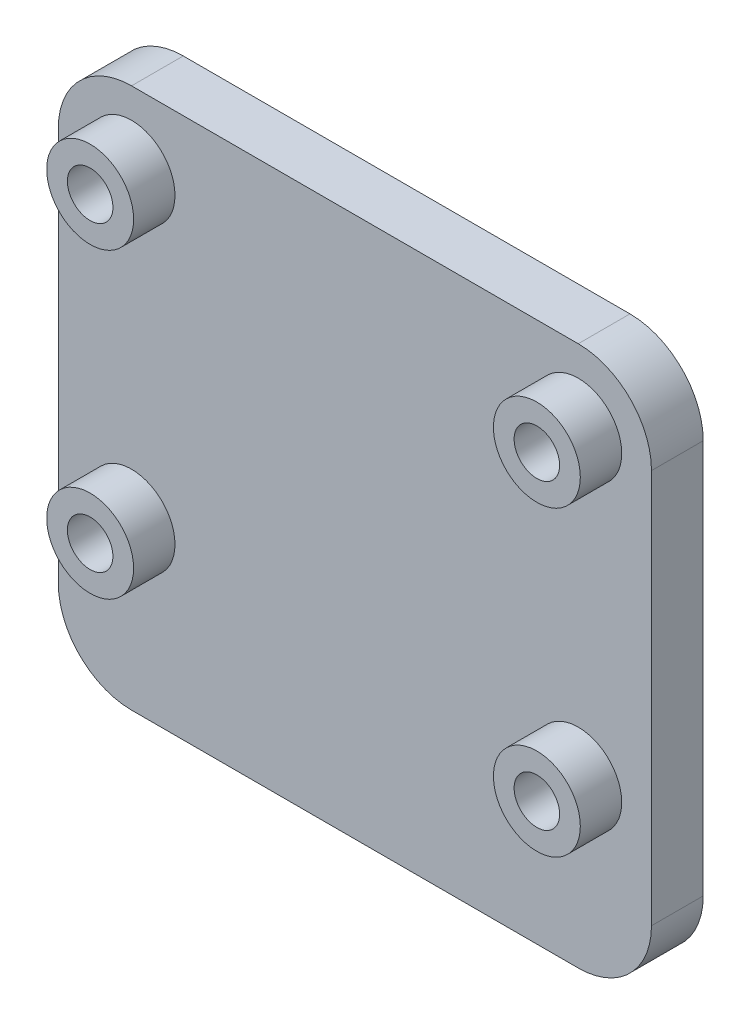
ISO-10303-21;
HEADER;
FILE_DESCRIPTION(('STEP AP214'),'2;1');
FILE_NAME('part.step','',(''),(''),'','','');
FILE_SCHEMA(('AUTOMOTIVE_DESIGN { 1 0 10303 214 1 1 1 1 }'));
ENDSEC;
DATA;
#1=APPLICATION_CONTEXT('core data for automotive mechanical design processes');
#2=APPLICATION_PROTOCOL_DEFINITION('international standard','automotive_design',2000,#1);
#3=PRODUCT_CONTEXT('',#1,'mechanical');
#4=PRODUCT('Part','Part','',(#3));
#5=PRODUCT_RELATED_PRODUCT_CATEGORY('part','',(#4));
#6=PRODUCT_DEFINITION_FORMATION('','',#4);
#7=PRODUCT_DEFINITION_CONTEXT('part definition',#1,'design');
#8=PRODUCT_DEFINITION('design','',#6,#7);
#9=PRODUCT_DEFINITION_SHAPE('','',#8);
#10=(LENGTH_UNIT() NAMED_UNIT(*) SI_UNIT(.MILLI.,.METRE.));
#11=(NAMED_UNIT(*) PLANE_ANGLE_UNIT() SI_UNIT($,.RADIAN.));
#12=(NAMED_UNIT(*) SI_UNIT($,.STERADIAN.) SOLID_ANGLE_UNIT());
#13=UNCERTAINTY_MEASURE_WITH_UNIT(LENGTH_MEASURE(1.E-05),#10,'distance_accuracy_value','');
#14=(GEOMETRIC_REPRESENTATION_CONTEXT(3) GLOBAL_UNCERTAINTY_ASSIGNED_CONTEXT((#13)) GLOBAL_UNIT_ASSIGNED_CONTEXT((#10,
#11,#12)) REPRESENTATION_CONTEXT('',''));
#15=CARTESIAN_POINT('',(0.,0.,0.));
#16=DIRECTION('',(0.,0.,1.));
#17=DIRECTION('',(1.,0.,0.));
#18=AXIS2_PLACEMENT_3D('',#15,#16,#17);
#19=CARTESIAN_POINT('',(0.,0.,2.5));
#20=DIRECTION('',(0.,0.,1.));
#21=DIRECTION('',(1.,0.,0.));
#22=AXIS2_PLACEMENT_3D('',#19,#20,#21);
#23=PLANE('',#22);
#24=CARTESIAN_POINT('',(10.795,-5.08,2.5));
#25=DIRECTION('',(0.,0.,1.));
#26=DIRECTION('',(1.,0.,0.));
#27=AXIS2_PLACEMENT_3D('',#24,#25,#26);
#28=CIRCLE('',#27,2.1);
#29=CARTESIAN_POINT('',(12.895,-5.08,2.5));
#30=VERTEX_POINT('',#29);
#31=EDGE_CURVE('E242',#30,#30,#28,.T.);
#32=ORIENTED_EDGE('',*,*,#31,.F.);
#33=EDGE_LOOP('',(#32));
#34=FACE_BOUND('',#33,.T.);
#35=CARTESIAN_POINT('',(-10.795,9.525,2.5));
#36=DIRECTION('',(0.,0.,1.));
#37=DIRECTION('',(1.,0.,0.));
#38=AXIS2_PLACEMENT_3D('',#35,#36,#37);
#39=CIRCLE('',#38,2.1);
#40=CARTESIAN_POINT('',(-8.695,9.525,2.5));
#41=VERTEX_POINT('',#40);
#42=EDGE_CURVE('E223',#41,#41,#39,.T.);
#43=ORIENTED_EDGE('',*,*,#42,.F.);
#44=EDGE_LOOP('',(#43));
#45=FACE_BOUND('',#44,.T.);
#46=DIRECTION('',(-1.,0.,0.));
#47=VECTOR('',#46,1.);
#48=CARTESIAN_POINT('',(0.,13.065,2.5));
#49=LINE('',#48,#47);
#50=CARTESIAN_POINT('',(10.795,13.065,2.5));
#51=VERTEX_POINT('',#50);
#52=CARTESIAN_POINT('',(-10.795,13.065,2.5));
#53=VERTEX_POINT('',#52);
#54=EDGE_CURVE('E189',#51,#53,#49,.T.);
#55=ORIENTED_EDGE('',*,*,#54,.T.);
#56=CARTESIAN_POINT('',(-10.795,9.525,2.5));
#57=DIRECTION('',(0.,0.,1.));
#58=DIRECTION('',(1.,0.,0.));
#59=AXIS2_PLACEMENT_3D('',#56,#57,#58);
#60=CIRCLE('',#59,3.54);
#61=CARTESIAN_POINT('',(-14.335,9.525,2.5));
#62=VERTEX_POINT('',#61);
#63=EDGE_CURVE('E125',#53,#62,#60,.T.);
#64=ORIENTED_EDGE('',*,*,#63,.T.);
#65=DIRECTION('',(0.,-1.,0.));
#66=VECTOR('',#65,1.);
#67=CARTESIAN_POINT('',(-14.335,0.,2.5));
#68=LINE('',#67,#66);
#69=CARTESIAN_POINT('',(-14.335,-9.525,2.5));
#70=VERTEX_POINT('',#69);
#71=EDGE_CURVE('E204',#62,#70,#68,.T.);
#72=ORIENTED_EDGE('',*,*,#71,.T.);
#73=CARTESIAN_POINT('',(-10.795,-9.525,2.5));
#74=DIRECTION('',(0.,0.,1.));
#75=DIRECTION('',(1.,0.,0.));
#76=AXIS2_PLACEMENT_3D('',#73,#74,#75);
#77=CIRCLE('',#76,3.54);
#78=CARTESIAN_POINT('',(-10.795,-13.065,2.5));
#79=VERTEX_POINT('',#78);
#80=EDGE_CURVE('E217',#70,#79,#77,.T.);
#81=ORIENTED_EDGE('',*,*,#80,.T.);
#82=DIRECTION('',(1.,0.,0.));
#83=VECTOR('',#82,1.);
#84=CARTESIAN_POINT('',(0.,-13.065,2.5));
#85=LINE('',#84,#83);
#86=CARTESIAN_POINT('',(10.795,-13.065,2.5));
#87=VERTEX_POINT('',#86);
#88=EDGE_CURVE('E144',#79,#87,#85,.T.);
#89=ORIENTED_EDGE('',*,*,#88,.T.);
#90=CARTESIAN_POINT('',(10.795,-9.525,2.5));
#91=DIRECTION('',(0.,0.,1.));
#92=DIRECTION('',(1.,0.,0.));
#93=AXIS2_PLACEMENT_3D('',#90,#91,#92);
#94=CIRCLE('',#93,3.54);
#95=CARTESIAN_POINT('',(14.335,-9.525,2.5));
#96=VERTEX_POINT('',#95);
#97=EDGE_CURVE('E138',#87,#96,#94,.T.);
#98=ORIENTED_EDGE('',*,*,#97,.T.);
#99=DIRECTION('',(0.,1.,0.));
#100=VECTOR('',#99,1.);
#101=CARTESIAN_POINT('',(14.335,0.,2.5));
#102=LINE('',#101,#100);
#103=CARTESIAN_POINT('',(14.335,9.525,2.5));
#104=VERTEX_POINT('',#103);
#105=EDGE_CURVE('E142',#96,#104,#102,.T.);
#106=ORIENTED_EDGE('',*,*,#105,.T.);
#107=CARTESIAN_POINT('',(10.795,9.525,2.5));
#108=DIRECTION('',(0.,0.,1.));
#109=DIRECTION('',(1.,0.,0.));
#110=AXIS2_PLACEMENT_3D('',#107,#108,#109);
#111=CIRCLE('',#110,3.54);
#112=EDGE_CURVE('E82',#104,#51,#111,.T.);
#113=ORIENTED_EDGE('',*,*,#112,.T.);
#114=EDGE_LOOP('',(#55,#64,#72,#81,#89,#98,#106,#113));
#115=FACE_BOUND('',#114,.T.);
#116=CARTESIAN_POINT('',(10.795,9.525,2.5));
#117=DIRECTION('',(0.,0.,1.));
#118=DIRECTION('',(1.,0.,0.));
#119=AXIS2_PLACEMENT_3D('',#116,#117,#118);
#120=CIRCLE('',#119,2.1);
#121=CARTESIAN_POINT('',(12.895,9.525,2.5));
#122=VERTEX_POINT('',#121);
#123=EDGE_CURVE('E251',#122,#122,#120,.T.);
#124=ORIENTED_EDGE('',*,*,#123,.F.);
#125=EDGE_LOOP('',(#124));
#126=FACE_BOUND('',#125,.T.);
#127=CARTESIAN_POINT('',(-10.795,-5.08,2.5));
#128=DIRECTION('',(0.,0.,1.));
#129=DIRECTION('',(1.,0.,0.));
#130=AXIS2_PLACEMENT_3D('',#127,#128,#129);
#131=CIRCLE('',#130,2.1);
#132=CARTESIAN_POINT('',(-8.695,-5.08,2.5));
#133=VERTEX_POINT('',#132);
#134=EDGE_CURVE('E232',#133,#133,#131,.T.);
#135=ORIENTED_EDGE('',*,*,#134,.F.);
#136=EDGE_LOOP('',(#135));
#137=FACE_BOUND('',#136,.T.);
#138=ADVANCED_FACE('F65',(#34,#45,#115,#126,#137),#23,.T.);
#139=CARTESIAN_POINT('',(0.,13.065,2.5));
#140=DIRECTION('',(0.,-1.,0.));
#141=DIRECTION('',(0.,0.,-1.));
#142=AXIS2_PLACEMENT_3D('',#139,#140,#141);
#143=PLANE('',#142);
#144=DIRECTION('',(-1.,0.,0.));
#145=VECTOR('',#144,1.);
#146=CARTESIAN_POINT('',(0.,13.065,0.));
#147=LINE('',#146,#145);
#148=CARTESIAN_POINT('',(10.795,13.065,0.));
#149=VERTEX_POINT('',#148);
#150=CARTESIAN_POINT('',(-10.795,13.065,0.));
#151=VERTEX_POINT('',#150);
#152=EDGE_CURVE('E162',#149,#151,#147,.T.);
#153=ORIENTED_EDGE('',*,*,#152,.T.);
#154=DIRECTION('',(0.,0.,-1.));
#155=VECTOR('',#154,1.);
#156=CARTESIAN_POINT('',(-10.795,13.065,2.5));
#157=LINE('',#156,#155);
#158=EDGE_CURVE('E12',#53,#151,#157,.T.);
#159=ORIENTED_EDGE('',*,*,#158,.F.);
#160=ORIENTED_EDGE('',*,*,#54,.F.);
#161=DIRECTION('',(0.,0.,-1.));
#162=VECTOR('',#161,1.);
#163=CARTESIAN_POINT('',(10.795,13.065,2.5));
#164=LINE('',#163,#162);
#165=EDGE_CURVE('E158',#51,#149,#164,.T.);
#166=ORIENTED_EDGE('',*,*,#165,.T.);
#167=EDGE_LOOP('',(#153,#159,#160,#166));
#168=FACE_BOUND('',#167,.T.);
#169=ADVANCED_FACE('F67',(#168),#143,.F.);
#170=CARTESIAN_POINT('',(-10.795,9.525,2.5));
#171=DIRECTION('',(0.,0.,-1.));
#172=DIRECTION('',(-1.,0.,0.));
#173=AXIS2_PLACEMENT_3D('',#170,#171,#172);
#174=CYLINDRICAL_SURFACE('',#173,3.54);
#175=CARTESIAN_POINT('',(-10.795,9.525,0.));
#176=DIRECTION('',(0.,0.,1.));
#177=DIRECTION('',(1.,0.,0.));
#178=AXIS2_PLACEMENT_3D('',#175,#176,#177);
#179=CIRCLE('',#178,3.54);
#180=CARTESIAN_POINT('',(-14.335,9.525,0.));
#181=VERTEX_POINT('',#180);
#182=EDGE_CURVE('E165',#151,#181,#179,.T.);
#183=ORIENTED_EDGE('',*,*,#182,.T.);
#184=DIRECTION('',(0.,0.,-1.));
#185=VECTOR('',#184,1.);
#186=CARTESIAN_POINT('',(-14.335,9.525,2.5));
#187=LINE('',#186,#185);
#188=EDGE_CURVE('E74',#62,#181,#187,.T.);
#189=ORIENTED_EDGE('',*,*,#188,.F.);
#190=ORIENTED_EDGE('',*,*,#63,.F.);
#191=ORIENTED_EDGE('',*,*,#158,.T.);
#192=EDGE_LOOP('',(#183,#189,#190,#191));
#193=FACE_BOUND('',#192,.T.);
#194=ADVANCED_FACE('F285',(#193),#174,.T.);
#195=CARTESIAN_POINT('',(-14.335,0.,2.5));
#196=DIRECTION('',(1.,0.,0.));
#197=DIRECTION('',(0.,0.,-1.));
#198=AXIS2_PLACEMENT_3D('',#195,#196,#197);
#199=PLANE('',#198);
#200=DIRECTION('',(0.,-1.,0.));
#201=VECTOR('',#200,1.);
#202=CARTESIAN_POINT('',(-14.335,0.,0.));
#203=LINE('',#202,#201);
#204=CARTESIAN_POINT('',(-14.335,-9.525,0.));
#205=VERTEX_POINT('',#204);
#206=EDGE_CURVE('E168',#181,#205,#203,.T.);
#207=ORIENTED_EDGE('',*,*,#206,.T.);
#208=DIRECTION('',(0.,0.,-1.));
#209=VECTOR('',#208,1.);
#210=CARTESIAN_POINT('',(-14.335,-9.525,2.5));
#211=LINE('',#210,#209);
#212=EDGE_CURVE('E196',#70,#205,#211,.T.);
#213=ORIENTED_EDGE('',*,*,#212,.F.);
#214=ORIENTED_EDGE('',*,*,#71,.F.);
#215=ORIENTED_EDGE('',*,*,#188,.T.);
#216=EDGE_LOOP('',(#207,#213,#214,#215));
#217=FACE_BOUND('',#216,.T.);
#218=ADVANCED_FACE('F202',(#217),#199,.F.);
#219=CARTESIAN_POINT('',(-10.795,-9.525,2.5));
#220=DIRECTION('',(0.,0.,-1.));
#221=DIRECTION('',(-1.,0.,0.));
#222=AXIS2_PLACEMENT_3D('',#219,#220,#221);
#223=CYLINDRICAL_SURFACE('',#222,3.54);
#224=CARTESIAN_POINT('',(-10.795,-9.525,0.));
#225=DIRECTION('',(0.,0.,1.));
#226=DIRECTION('',(1.,0.,0.));
#227=AXIS2_PLACEMENT_3D('',#224,#225,#226);
#228=CIRCLE('',#227,3.54);
#229=CARTESIAN_POINT('',(-10.795,-13.065,0.));
#230=VERTEX_POINT('',#229);
#231=EDGE_CURVE('E170',#205,#230,#228,.T.);
#232=ORIENTED_EDGE('',*,*,#231,.T.);
#233=DIRECTION('',(0.,0.,-1.));
#234=VECTOR('',#233,1.);
#235=CARTESIAN_POINT('',(-10.795,-13.065,2.5));
#236=LINE('',#235,#234);
#237=EDGE_CURVE('E193',#79,#230,#236,.T.);
#238=ORIENTED_EDGE('',*,*,#237,.F.);
#239=ORIENTED_EDGE('',*,*,#80,.F.);
#240=ORIENTED_EDGE('',*,*,#212,.T.);
#241=EDGE_LOOP('',(#232,#238,#239,#240));
#242=FACE_BOUND('',#241,.T.);
#243=ADVANCED_FACE('F213',(#242),#223,.T.);
#244=CARTESIAN_POINT('',(0.,-13.065,2.5));
#245=DIRECTION('',(0.,1.,0.));
#246=DIRECTION('',(0.,0.,1.));
#247=AXIS2_PLACEMENT_3D('',#244,#245,#246);
#248=PLANE('',#247);
#249=DIRECTION('',(1.,0.,0.));
#250=VECTOR('',#249,1.);
#251=CARTESIAN_POINT('',(0.,-13.065,0.));
#252=LINE('',#251,#250);
#253=CARTESIAN_POINT('',(10.795,-13.065,0.));
#254=VERTEX_POINT('',#253);
#255=EDGE_CURVE('E172',#230,#254,#252,.T.);
#256=ORIENTED_EDGE('',*,*,#255,.T.);
#257=DIRECTION('',(0.,0.,-1.));
#258=VECTOR('',#257,1.);
#259=CARTESIAN_POINT('',(10.795,-13.065,2.5));
#260=LINE('',#259,#258);
#261=EDGE_CURVE('E153',#87,#254,#260,.T.);
#262=ORIENTED_EDGE('',*,*,#261,.F.);
#263=ORIENTED_EDGE('',*,*,#88,.F.);
#264=ORIENTED_EDGE('',*,*,#237,.T.);
#265=EDGE_LOOP('',(#256,#262,#263,#264));
#266=FACE_BOUND('',#265,.T.);
#267=ADVANCED_FACE('F216',(#266),#248,.F.);
#268=CARTESIAN_POINT('',(10.795,-9.525,2.5));
#269=DIRECTION('',(0.,0.,-1.));
#270=DIRECTION('',(-1.,0.,0.));
#271=AXIS2_PLACEMENT_3D('',#268,#269,#270);
#272=CYLINDRICAL_SURFACE('',#271,3.54);
#273=CARTESIAN_POINT('',(10.795,-9.525,0.));
#274=DIRECTION('',(0.,0.,1.));
#275=DIRECTION('',(1.,0.,0.));
#276=AXIS2_PLACEMENT_3D('',#273,#274,#275);
#277=CIRCLE('',#276,3.54);
#278=CARTESIAN_POINT('',(14.335,-9.525,0.));
#279=VERTEX_POINT('',#278);
#280=EDGE_CURVE('E152',#254,#279,#277,.T.);
#281=ORIENTED_EDGE('',*,*,#280,.T.);
#282=DIRECTION('',(0.,0.,-1.));
#283=VECTOR('',#282,1.);
#284=CARTESIAN_POINT('',(14.335,-9.525,2.5));
#285=LINE('',#284,#283);
#286=EDGE_CURVE('E149',#96,#279,#285,.T.);
#287=ORIENTED_EDGE('',*,*,#286,.F.);
#288=ORIENTED_EDGE('',*,*,#97,.F.);
#289=ORIENTED_EDGE('',*,*,#261,.T.);
#290=EDGE_LOOP('',(#281,#287,#288,#289));
#291=FACE_BOUND('',#290,.T.);
#292=ADVANCED_FACE('F150',(#291),#272,.T.);
#293=CARTESIAN_POINT('',(14.335,0.,2.5));
#294=DIRECTION('',(-1.,0.,0.));
#295=DIRECTION('',(0.,0.,1.));
#296=AXIS2_PLACEMENT_3D('',#293,#294,#295);
#297=PLANE('',#296);
#298=DIRECTION('',(0.,1.,0.));
#299=VECTOR('',#298,1.);
#300=CARTESIAN_POINT('',(14.335,0.,0.));
#301=LINE('',#300,#299);
#302=CARTESIAN_POINT('',(14.335,9.525,0.));
#303=VERTEX_POINT('',#302);
#304=EDGE_CURVE('E111',#279,#303,#301,.T.);
#305=ORIENTED_EDGE('',*,*,#304,.T.);
#306=DIRECTION('',(0.,0.,-1.));
#307=VECTOR('',#306,1.);
#308=CARTESIAN_POINT('',(14.335,9.525,2.5));
#309=LINE('',#308,#307);
#310=EDGE_CURVE('E154',#104,#303,#309,.T.);
#311=ORIENTED_EDGE('',*,*,#310,.F.);
#312=ORIENTED_EDGE('',*,*,#105,.F.);
#313=ORIENTED_EDGE('',*,*,#286,.T.);
#314=EDGE_LOOP('',(#305,#311,#312,#313));
#315=FACE_BOUND('',#314,.T.);
#316=ADVANCED_FACE('F156',(#315),#297,.F.);
#317=CARTESIAN_POINT('',(10.795,-5.08,2.5));
#318=DIRECTION('',(0.,0.,-1.));
#319=DIRECTION('',(-1.,0.,0.));
#320=AXIS2_PLACEMENT_3D('',#317,#318,#319);
#321=CYLINDRICAL_SURFACE('',#320,1.1);
#322=CARTESIAN_POINT('',(10.795,-5.08,0.));
#323=DIRECTION('',(0.,0.,1.));
#324=DIRECTION('',(1.,0.,0.));
#325=AXIS2_PLACEMENT_3D('',#322,#323,#324);
#326=CIRCLE('',#325,1.1);
#327=CARTESIAN_POINT('',(11.895,-5.08,0.));
#328=VERTEX_POINT('',#327);
#329=EDGE_CURVE('E183',#328,#328,#326,.T.);
#330=ORIENTED_EDGE('',*,*,#329,.F.);
#331=EDGE_LOOP('',(#330));
#332=FACE_BOUND('',#331,.T.);
#333=CARTESIAN_POINT('',(10.795,-5.08,4.5));
#334=DIRECTION('',(0.,0.,1.));
#335=DIRECTION('',(1.,0.,0.));
#336=AXIS2_PLACEMENT_3D('',#333,#334,#335);
#337=CIRCLE('',#336,1.1);
#338=CARTESIAN_POINT('',(11.895,-5.08,4.5));
#339=VERTEX_POINT('',#338);
#340=EDGE_CURVE('E239',#339,#339,#337,.T.);
#341=ORIENTED_EDGE('',*,*,#340,.T.);
#342=EDGE_LOOP('',(#341));
#343=FACE_BOUND('',#342,.T.);
#344=ADVANCED_FACE('F296',(#332,#343),#321,.F.);
#345=CARTESIAN_POINT('',(-10.795,-5.08,2.5));
#346=DIRECTION('',(0.,0.,-1.));
#347=DIRECTION('',(-1.,0.,0.));
#348=AXIS2_PLACEMENT_3D('',#345,#346,#347);
#349=CYLINDRICAL_SURFACE('',#348,1.1);
#350=CARTESIAN_POINT('',(-10.795,-5.08,0.));
#351=DIRECTION('',(0.,0.,1.));
#352=DIRECTION('',(1.,0.,0.));
#353=AXIS2_PLACEMENT_3D('',#350,#351,#352);
#354=CIRCLE('',#353,1.1);
#355=CARTESIAN_POINT('',(-9.695,-5.08,0.));
#356=VERTEX_POINT('',#355);
#357=EDGE_CURVE('E180',#356,#356,#354,.T.);
#358=ORIENTED_EDGE('',*,*,#357,.F.);
#359=EDGE_LOOP('',(#358));
#360=FACE_BOUND('',#359,.T.);
#361=CARTESIAN_POINT('',(-10.795,-5.08,4.5));
#362=DIRECTION('',(0.,0.,1.));
#363=DIRECTION('',(1.,0.,0.));
#364=AXIS2_PLACEMENT_3D('',#361,#362,#363);
#365=CIRCLE('',#364,1.1);
#366=CARTESIAN_POINT('',(-9.695,-5.08,4.5));
#367=VERTEX_POINT('',#366);
#368=EDGE_CURVE('E236',#367,#367,#365,.T.);
#369=ORIENTED_EDGE('',*,*,#368,.T.);
#370=EDGE_LOOP('',(#369));
#371=FACE_BOUND('',#370,.T.);
#372=ADVANCED_FACE('F298',(#360,#371),#349,.F.);
#373=CARTESIAN_POINT('',(-10.795,9.525,2.5));
#374=DIRECTION('',(0.,0.,-1.));
#375=DIRECTION('',(-1.,0.,0.));
#376=AXIS2_PLACEMENT_3D('',#373,#374,#375);
#377=CYLINDRICAL_SURFACE('',#376,1.1);
#378=CARTESIAN_POINT('',(-10.795,9.525,0.));
#379=DIRECTION('',(0.,0.,1.));
#380=DIRECTION('',(1.,0.,0.));
#381=AXIS2_PLACEMENT_3D('',#378,#379,#380);
#382=CIRCLE('',#381,1.1);
#383=CARTESIAN_POINT('',(-9.695,9.525,0.));
#384=VERTEX_POINT('',#383);
#385=EDGE_CURVE('E177',#384,#384,#382,.T.);
#386=ORIENTED_EDGE('',*,*,#385,.F.);
#387=EDGE_LOOP('',(#386));
#388=FACE_BOUND('',#387,.T.);
#389=CARTESIAN_POINT('',(-10.795,9.525,4.5));
#390=DIRECTION('',(0.,0.,1.));
#391=DIRECTION('',(1.,0.,0.));
#392=AXIS2_PLACEMENT_3D('',#389,#390,#391);
#393=CIRCLE('',#392,1.1);
#394=CARTESIAN_POINT('',(-9.695,9.525,4.5));
#395=VERTEX_POINT('',#394);
#396=EDGE_CURVE('E226',#395,#395,#393,.T.);
#397=ORIENTED_EDGE('',*,*,#396,.T.);
#398=EDGE_LOOP('',(#397));
#399=FACE_BOUND('',#398,.T.);
#400=ADVANCED_FACE('F302',(#388,#399),#377,.F.);
#401=CARTESIAN_POINT('',(10.795,9.525,2.5));
#402=DIRECTION('',(0.,0.,-1.));
#403=DIRECTION('',(-1.,0.,0.));
#404=AXIS2_PLACEMENT_3D('',#401,#402,#403);
#405=CYLINDRICAL_SURFACE('',#404,3.54);
#406=CARTESIAN_POINT('',(10.795,9.525,0.));
#407=DIRECTION('',(0.,0.,1.));
#408=DIRECTION('',(1.,0.,0.));
#409=AXIS2_PLACEMENT_3D('',#406,#407,#408);
#410=CIRCLE('',#409,3.54);
#411=EDGE_CURVE('E117',#303,#149,#410,.T.);
#412=ORIENTED_EDGE('',*,*,#411,.T.);
#413=ORIENTED_EDGE('',*,*,#165,.F.);
#414=ORIENTED_EDGE('',*,*,#112,.F.);
#415=ORIENTED_EDGE('',*,*,#310,.T.);
#416=EDGE_LOOP('',(#412,#413,#414,#415));
#417=FACE_BOUND('',#416,.T.);
#418=ADVANCED_FACE('F294',(#417),#405,.T.);
#419=CARTESIAN_POINT('',(10.795,9.525,2.5));
#420=DIRECTION('',(0.,0.,-1.));
#421=DIRECTION('',(-1.,0.,0.));
#422=AXIS2_PLACEMENT_3D('',#419,#420,#421);
#423=CYLINDRICAL_SURFACE('',#422,1.1);
#424=CARTESIAN_POINT('',(10.795,9.525,0.));
#425=DIRECTION('',(0.,0.,1.));
#426=DIRECTION('',(1.,0.,0.));
#427=AXIS2_PLACEMENT_3D('',#424,#425,#426);
#428=CIRCLE('',#427,1.1);
#429=CARTESIAN_POINT('',(11.895,9.525,0.));
#430=VERTEX_POINT('',#429);
#431=EDGE_CURVE('E186',#430,#430,#428,.T.);
#432=ORIENTED_EDGE('',*,*,#431,.F.);
#433=EDGE_LOOP('',(#432));
#434=FACE_BOUND('',#433,.T.);
#435=CARTESIAN_POINT('',(10.795,9.525,4.5));
#436=DIRECTION('',(0.,0.,1.));
#437=DIRECTION('',(1.,0.,0.));
#438=AXIS2_PLACEMENT_3D('',#435,#436,#437);
#439=CIRCLE('',#438,1.1);
#440=CARTESIAN_POINT('',(11.895,9.525,4.5));
#441=VERTEX_POINT('',#440);
#442=EDGE_CURVE('E248',#441,#441,#439,.T.);
#443=ORIENTED_EDGE('',*,*,#442,.T.);
#444=EDGE_LOOP('',(#443));
#445=FACE_BOUND('',#444,.T.);
#446=ADVANCED_FACE('F259',(#434,#445),#423,.F.);
#447=CARTESIAN_POINT('',(0.,0.,0.));
#448=DIRECTION('',(0.,0.,1.));
#449=DIRECTION('',(1.,0.,0.));
#450=AXIS2_PLACEMENT_3D('',#447,#448,#449);
#451=PLANE('',#450);
#452=ORIENTED_EDGE('',*,*,#152,.F.);
#453=ORIENTED_EDGE('',*,*,#411,.F.);
#454=ORIENTED_EDGE('',*,*,#304,.F.);
#455=ORIENTED_EDGE('',*,*,#280,.F.);
#456=ORIENTED_EDGE('',*,*,#255,.F.);
#457=ORIENTED_EDGE('',*,*,#231,.F.);
#458=ORIENTED_EDGE('',*,*,#206,.F.);
#459=ORIENTED_EDGE('',*,*,#182,.F.);
#460=EDGE_LOOP('',(#452,#453,#454,#455,#456,#457,#458,#459));
#461=FACE_BOUND('',#460,.T.);
#462=ORIENTED_EDGE('',*,*,#385,.T.);
#463=EDGE_LOOP('',(#462));
#464=FACE_BOUND('',#463,.T.);
#465=ORIENTED_EDGE('',*,*,#357,.T.);
#466=EDGE_LOOP('',(#465));
#467=FACE_BOUND('',#466,.T.);
#468=ORIENTED_EDGE('',*,*,#329,.T.);
#469=EDGE_LOOP('',(#468));
#470=FACE_BOUND('',#469,.T.);
#471=ORIENTED_EDGE('',*,*,#431,.T.);
#472=EDGE_LOOP('',(#471));
#473=FACE_BOUND('',#472,.T.);
#474=ADVANCED_FACE('F208',(#461,#464,#467,#470,#473),#451,.F.);
#475=CARTESIAN_POINT('',(-10.795,9.525,4.5));
#476=DIRECTION('',(0.,0.,1.));
#477=DIRECTION('',(1.,0.,0.));
#478=AXIS2_PLACEMENT_3D('',#475,#476,#477);
#479=PLANE('',#478);
#480=CARTESIAN_POINT('',(-10.795,9.525,4.5));
#481=DIRECTION('',(0.,0.,1.));
#482=DIRECTION('',(1.,0.,0.));
#483=AXIS2_PLACEMENT_3D('',#480,#481,#482);
#484=CIRCLE('',#483,2.1);
#485=CARTESIAN_POINT('',(-8.695,9.525,4.5));
#486=VERTEX_POINT('',#485);
#487=EDGE_CURVE('E166',#486,#486,#484,.T.);
#488=ORIENTED_EDGE('',*,*,#487,.T.);
#489=EDGE_LOOP('',(#488));
#490=FACE_BOUND('',#489,.T.);
#491=ORIENTED_EDGE('',*,*,#396,.F.);
#492=EDGE_LOOP('',(#491));
#493=FACE_BOUND('',#492,.T.);
#494=ADVANCED_FACE('F274',(#490,#493),#479,.T.);
#495=CARTESIAN_POINT('',(-10.795,9.525,4.5));
#496=DIRECTION('',(0.,0.,-1.));
#497=DIRECTION('',(-1.,0.,0.));
#498=AXIS2_PLACEMENT_3D('',#495,#496,#497);
#499=CYLINDRICAL_SURFACE('',#498,2.1);
#500=ORIENTED_EDGE('',*,*,#487,.F.);
#501=EDGE_LOOP('',(#500));
#502=FACE_BOUND('',#501,.T.);
#503=ORIENTED_EDGE('',*,*,#42,.T.);
#504=EDGE_LOOP('',(#503));
#505=FACE_BOUND('',#504,.T.);
#506=ADVANCED_FACE('F264',(#502,#505),#499,.T.);
#507=CARTESIAN_POINT('',(10.795,9.525,4.5));
#508=DIRECTION('',(0.,0.,1.));
#509=DIRECTION('',(1.,0.,0.));
#510=AXIS2_PLACEMENT_3D('',#507,#508,#509);
#511=PLANE('',#510);
#512=CARTESIAN_POINT('',(10.795,9.525,4.5));
#513=DIRECTION('',(0.,0.,1.));
#514=DIRECTION('',(1.,0.,0.));
#515=AXIS2_PLACEMENT_3D('',#512,#513,#514);
#516=CIRCLE('',#515,2.1);
#517=CARTESIAN_POINT('',(12.895,9.525,4.5));
#518=VERTEX_POINT('',#517);
#519=EDGE_CURVE('E231',#518,#518,#516,.T.);
#520=ORIENTED_EDGE('',*,*,#519,.T.);
#521=EDGE_LOOP('',(#520));
#522=FACE_BOUND('',#521,.T.);
#523=ORIENTED_EDGE('',*,*,#442,.F.);
#524=EDGE_LOOP('',(#523));
#525=FACE_BOUND('',#524,.T.);
#526=ADVANCED_FACE('F261',(#522,#525),#511,.T.);
#527=CARTESIAN_POINT('',(10.795,9.525,4.5));
#528=DIRECTION('',(0.,0.,-1.));
#529=DIRECTION('',(-1.,0.,0.));
#530=AXIS2_PLACEMENT_3D('',#527,#528,#529);
#531=CYLINDRICAL_SURFACE('',#530,2.1);
#532=ORIENTED_EDGE('',*,*,#519,.F.);
#533=EDGE_LOOP('',(#532));
#534=FACE_BOUND('',#533,.T.);
#535=ORIENTED_EDGE('',*,*,#123,.T.);
#536=EDGE_LOOP('',(#535));
#537=FACE_BOUND('',#536,.T.);
#538=ADVANCED_FACE('F263',(#534,#537),#531,.T.);
#539=CARTESIAN_POINT('',(10.795,-5.08,4.5));
#540=DIRECTION('',(0.,0.,1.));
#541=DIRECTION('',(1.,0.,0.));
#542=AXIS2_PLACEMENT_3D('',#539,#540,#541);
#543=PLANE('',#542);
#544=CARTESIAN_POINT('',(10.795,-5.08,4.5));
#545=DIRECTION('',(0.,0.,1.));
#546=DIRECTION('',(1.,0.,0.));
#547=AXIS2_PLACEMENT_3D('',#544,#545,#546);
#548=CIRCLE('',#547,2.1);
#549=CARTESIAN_POINT('',(12.895,-5.08,4.5));
#550=VERTEX_POINT('',#549);
#551=EDGE_CURVE('E245',#550,#550,#548,.T.);
#552=ORIENTED_EDGE('',*,*,#551,.T.);
#553=EDGE_LOOP('',(#552));
#554=FACE_BOUND('',#553,.T.);
#555=ORIENTED_EDGE('',*,*,#340,.F.);
#556=EDGE_LOOP('',(#555));
#557=FACE_BOUND('',#556,.T.);
#558=ADVANCED_FACE('F271',(#554,#557),#543,.T.);
#559=CARTESIAN_POINT('',(10.795,-5.08,4.5));
#560=DIRECTION('',(0.,0.,-1.));
#561=DIRECTION('',(-1.,0.,0.));
#562=AXIS2_PLACEMENT_3D('',#559,#560,#561);
#563=CYLINDRICAL_SURFACE('',#562,2.1);
#564=ORIENTED_EDGE('',*,*,#551,.F.);
#565=EDGE_LOOP('',(#564));
#566=FACE_BOUND('',#565,.T.);
#567=ORIENTED_EDGE('',*,*,#31,.T.);
#568=EDGE_LOOP('',(#567));
#569=FACE_BOUND('',#568,.T.);
#570=ADVANCED_FACE('F446',(#566,#569),#563,.T.);
#571=CARTESIAN_POINT('',(-10.795,-5.08,4.5));
#572=DIRECTION('',(0.,0.,1.));
#573=DIRECTION('',(1.,0.,0.));
#574=AXIS2_PLACEMENT_3D('',#571,#572,#573);
#575=PLANE('',#574);
#576=CARTESIAN_POINT('',(-10.795,-5.08,4.5));
#577=DIRECTION('',(0.,0.,1.));
#578=DIRECTION('',(1.,0.,0.));
#579=AXIS2_PLACEMENT_3D('',#576,#577,#578);
#580=CIRCLE('',#579,2.1);
#581=CARTESIAN_POINT('',(-8.695,-5.08,4.5));
#582=VERTEX_POINT('',#581);
#583=EDGE_CURVE('E235',#582,#582,#580,.T.);
#584=ORIENTED_EDGE('',*,*,#583,.T.);
#585=EDGE_LOOP('',(#584));
#586=FACE_BOUND('',#585,.T.);
#587=ORIENTED_EDGE('',*,*,#368,.F.);
#588=EDGE_LOOP('',(#587));
#589=FACE_BOUND('',#588,.T.);
#590=ADVANCED_FACE('F456',(#586,#589),#575,.T.);
#591=CARTESIAN_POINT('',(-10.795,-5.08,4.5));
#592=DIRECTION('',(0.,0.,-1.));
#593=DIRECTION('',(-1.,0.,0.));
#594=AXIS2_PLACEMENT_3D('',#591,#592,#593);
#595=CYLINDRICAL_SURFACE('',#594,2.1);
#596=ORIENTED_EDGE('',*,*,#583,.F.);
#597=EDGE_LOOP('',(#596));
#598=FACE_BOUND('',#597,.T.);
#599=ORIENTED_EDGE('',*,*,#134,.T.);
#600=EDGE_LOOP('',(#599));
#601=FACE_BOUND('',#600,.T.);
#602=ADVANCED_FACE('F466',(#598,#601),#595,.T.);
#603=CLOSED_SHELL('',(#138,#169,#194,#218,#243,#267,#292,#316,#344,#372,#400,#418,#446,#474,
#494,#506,#526,#538,#558,#570,#590,#602));
#604=MANIFOLD_SOLID_BREP('B2',#603);
#605=ADVANCED_BREP_SHAPE_REPRESENTATION('',(#18,#604),#14);
#606=SHAPE_DEFINITION_REPRESENTATION(#9,#605);
ENDSEC;
END-ISO-10303-21;
